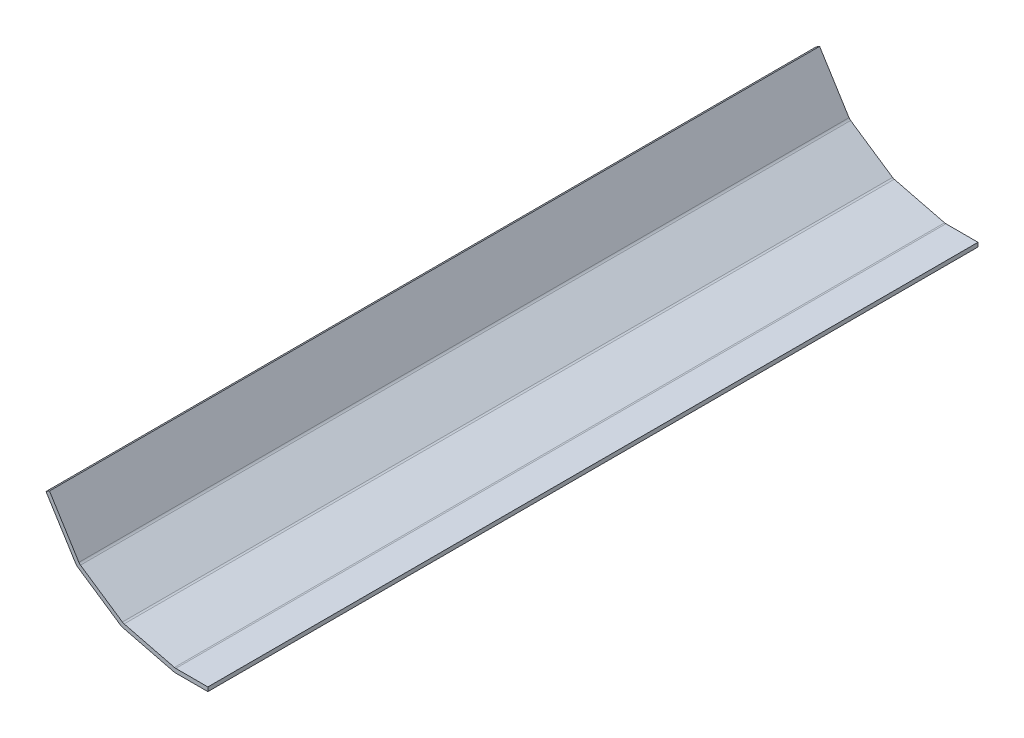
ISO-10303-21;
HEADER;
FILE_DESCRIPTION(('STEP AP214'),'2;1');
FILE_NAME('part.step','',(''),(''),'','','');
FILE_SCHEMA(('AUTOMOTIVE_DESIGN { 1 0 10303 214 1 1 1 1 }'));
ENDSEC;
DATA;
#1=APPLICATION_CONTEXT('core data for automotive mechanical design processes');
#2=APPLICATION_PROTOCOL_DEFINITION('international standard','automotive_design',2000,#1);
#3=PRODUCT_CONTEXT('',#1,'mechanical');
#4=PRODUCT('Part','Part','',(#3));
#5=PRODUCT_RELATED_PRODUCT_CATEGORY('part','',(#4));
#6=PRODUCT_DEFINITION_FORMATION('','',#4);
#7=PRODUCT_DEFINITION_CONTEXT('part definition',#1,'design');
#8=PRODUCT_DEFINITION('design','',#6,#7);
#9=PRODUCT_DEFINITION_SHAPE('','',#8);
#10=(LENGTH_UNIT() NAMED_UNIT(*) SI_UNIT(.MILLI.,.METRE.));
#11=(NAMED_UNIT(*) PLANE_ANGLE_UNIT() SI_UNIT($,.RADIAN.));
#12=(NAMED_UNIT(*) SI_UNIT($,.STERADIAN.) SOLID_ANGLE_UNIT());
#13=UNCERTAINTY_MEASURE_WITH_UNIT(LENGTH_MEASURE(1.E-05),#10,'distance_accuracy_value','');
#14=(GEOMETRIC_REPRESENTATION_CONTEXT(3) GLOBAL_UNCERTAINTY_ASSIGNED_CONTEXT((#13)) GLOBAL_UNIT_ASSIGNED_CONTEXT((#10,
#11,#12)) REPRESENTATION_CONTEXT('',''));
#15=CARTESIAN_POINT('',(0.,0.,0.));
#16=DIRECTION('',(0.,0.,1.));
#17=DIRECTION('',(1.,0.,0.));
#18=AXIS2_PLACEMENT_3D('',#15,#16,#17);
#19=CARTESIAN_POINT('',(151.999999999886,1.50000000001131,282.));
#20=DIRECTION('',(-1.,0.,0.));
#21=DIRECTION('',(0.,0.,1.));
#22=AXIS2_PLACEMENT_3D('',#19,#20,#21);
#23=PLANE('',#22);
#24=DIRECTION('',(0.,1.,0.));
#25=VECTOR('',#24,1.);
#26=CARTESIAN_POINT('',(151.999999999886,1.50000000001131,0.));
#27=LINE('',#26,#25);
#28=CARTESIAN_POINT('',(151.999999999886,1.50000000001131,0.));
#29=VERTEX_POINT('',#28);
#30=CARTESIAN_POINT('',(151.999999999886,2.99999999983093,0.));
#31=VERTEX_POINT('',#30);
#32=EDGE_CURVE('E195',#29,#31,#27,.T.);
#33=ORIENTED_EDGE('',*,*,#32,.T.);
#34=DIRECTION('',(0.,0.,-1.));
#35=VECTOR('',#34,1.);
#36=CARTESIAN_POINT('',(151.999999999886,2.99999999983093,282.));
#37=LINE('',#36,#35);
#38=CARTESIAN_POINT('',(151.999999999886,2.99999999983093,282.));
#39=VERTEX_POINT('',#38);
#40=EDGE_CURVE('E11',#39,#31,#37,.T.);
#41=ORIENTED_EDGE('',*,*,#40,.F.);
#42=DIRECTION('',(0.,1.,0.));
#43=VECTOR('',#42,1.);
#44=CARTESIAN_POINT('',(151.999999999886,1.50000000001131,282.));
#45=LINE('',#44,#43);
#46=CARTESIAN_POINT('',(151.999999999886,1.50000000001131,282.));
#47=VERTEX_POINT('',#46);
#48=EDGE_CURVE('E241',#47,#39,#45,.T.);
#49=ORIENTED_EDGE('',*,*,#48,.F.);
#50=DIRECTION('',(0.,0.,-1.));
#51=VECTOR('',#50,1.);
#52=CARTESIAN_POINT('',(151.999999999886,1.50000000001131,282.));
#53=LINE('',#52,#51);
#54=EDGE_CURVE('E191',#47,#29,#53,.T.);
#55=ORIENTED_EDGE('',*,*,#54,.T.);
#56=EDGE_LOOP('',(#33,#41,#49,#55));
#57=FACE_BOUND('',#56,.T.);
#58=ADVANCED_FACE('F45',(#57),#23,.F.);
#59=CARTESIAN_POINT('',(151.999999999886,2.99999999983093,282.));
#60=DIRECTION('',(0.,-1.,0.));
#61=DIRECTION('',(0.,0.,-1.));
#62=AXIS2_PLACEMENT_3D('',#59,#60,#61);
#63=PLANE('',#62);
#64=DIRECTION('',(-1.,0.,0.));
#65=VECTOR('',#64,1.);
#66=CARTESIAN_POINT('',(151.999999999886,2.99999999983093,0.));
#67=LINE('',#66,#65);
#68=CARTESIAN_POINT('',(140.245569121886,2.99999999983093,0.));
#69=VERTEX_POINT('',#68);
#70=EDGE_CURVE('E199',#31,#69,#67,.T.);
#71=ORIENTED_EDGE('',*,*,#70,.T.);
#72=DIRECTION('',(0.,0.,-1.));
#73=VECTOR('',#72,1.);
#74=CARTESIAN_POINT('',(140.245569121886,2.99999999983093,282.));
#75=LINE('',#74,#73);
#76=CARTESIAN_POINT('',(140.245569121886,2.99999999983093,282.));
#77=VERTEX_POINT('',#76);
#78=EDGE_CURVE('E54',#77,#69,#75,.T.);
#79=ORIENTED_EDGE('',*,*,#78,.F.);
#80=DIRECTION('',(-1.,0.,0.));
#81=VECTOR('',#80,1.);
#82=CARTESIAN_POINT('',(151.999999999886,2.99999999983093,282.));
#83=LINE('',#82,#81);
#84=EDGE_CURVE('E129',#39,#77,#83,.T.);
#85=ORIENTED_EDGE('',*,*,#84,.F.);
#86=ORIENTED_EDGE('',*,*,#40,.T.);
#87=EDGE_LOOP('',(#71,#79,#85,#86));
#88=FACE_BOUND('',#87,.T.);
#89=ADVANCED_FACE('F361',(#88),#63,.F.);
#90=CARTESIAN_POINT('',(140.24556912768,5.0000000600324,282.));
#91=DIRECTION('',(0.,0.,-1.));
#92=DIRECTION('',(-1.,0.,0.));
#93=AXIS2_PLACEMENT_3D('',#90,#91,#92);
#94=CYLINDRICAL_SURFACE('',#93,2.00000006020147);
#95=CARTESIAN_POINT('',(140.24556912768,5.0000000600324,0.));
#96=DIRECTION('',(0.,0.,-1.));
#97=DIRECTION('',(-1.,0.,0.));
#98=AXIS2_PLACEMENT_3D('',#95,#96,#97);
#99=CIRCLE('',#98,2.00000006020147);
#100=CARTESIAN_POINT('',(139.761725330886,3.05940854683092,0.));
#101=VERTEX_POINT('',#100);
#102=EDGE_CURVE('E202',#69,#101,#99,.T.);
#103=ORIENTED_EDGE('',*,*,#102,.T.);
#104=DIRECTION('',(0.,0.,-1.));
#105=VECTOR('',#104,1.);
#106=CARTESIAN_POINT('',(139.761725330886,3.05940854683092,282.));
#107=LINE('',#106,#105);
#108=CARTESIAN_POINT('',(139.761725330886,3.05940854683092,282.));
#109=VERTEX_POINT('',#108);
#110=EDGE_CURVE('E284',#109,#101,#107,.T.);
#111=ORIENTED_EDGE('',*,*,#110,.F.);
#112=CARTESIAN_POINT('',(140.24556912768,5.0000000600324,282.));
#113=DIRECTION('',(0.,0.,-1.));
#114=DIRECTION('',(-1.,0.,0.));
#115=AXIS2_PLACEMENT_3D('',#112,#113,#114);
#116=CIRCLE('',#115,2.00000006020147);
#117=EDGE_CURVE('E295',#77,#109,#116,.T.);
#118=ORIENTED_EDGE('',*,*,#117,.F.);
#119=ORIENTED_EDGE('',*,*,#78,.T.);
#120=EDGE_LOOP('',(#103,#111,#118,#119));
#121=FACE_BOUND('',#120,.T.);
#122=ADVANCED_FACE('F293',(#121),#94,.F.);
#123=CARTESIAN_POINT('',(139.761725330886,3.05940854683092,282.));
#124=DIRECTION('',(-0.241921895612643,-0.970295726272761,0.));
#125=DIRECTION('',(0.970295726272762,-0.241921895612643,0.));
#126=AXIS2_PLACEMENT_3D('',#123,#124,#125);
#127=PLANE('',#126);
#128=DIRECTION('',(-0.970295726272761,0.241921895612643,0.));
#129=VECTOR('',#128,1.);
#130=CARTESIAN_POINT('',(139.761725330886,3.05940854683092,0.));
#131=LINE('',#130,#129);
#132=CARTESIAN_POINT('',(121.342178631886,7.65191733883092,0.));
#133=VERTEX_POINT('',#132);
#134=EDGE_CURVE('E205',#101,#133,#131,.T.);
#135=ORIENTED_EDGE('',*,*,#134,.T.);
#136=DIRECTION('',(0.,0.,-1.));
#137=VECTOR('',#136,1.);
#138=CARTESIAN_POINT('',(121.342178631886,7.65191733883092,282.));
#139=LINE('',#138,#137);
#140=CARTESIAN_POINT('',(121.342178631886,7.65191733883092,282.));
#141=VERTEX_POINT('',#140);
#142=EDGE_CURVE('E280',#141,#133,#139,.T.);
#143=ORIENTED_EDGE('',*,*,#142,.F.);
#144=DIRECTION('',(-0.970295726272761,0.241921895612643,0.));
#145=VECTOR('',#144,1.);
#146=CARTESIAN_POINT('',(139.761725330886,3.05940854683092,282.));
#147=LINE('',#146,#145);
#148=EDGE_CURVE('E313',#109,#141,#147,.T.);
#149=ORIENTED_EDGE('',*,*,#148,.F.);
#150=ORIENTED_EDGE('',*,*,#110,.T.);
#151=EDGE_LOOP('',(#135,#143,#149,#150));
#152=FACE_BOUND('',#151,.T.);
#153=ADVANCED_FACE('F304',(#152),#127,.F.);
#154=CARTESIAN_POINT('',(121.826022412614,9.59250876561039,282.));
#155=DIRECTION('',(0.,0.,-1.));
#156=DIRECTION('',(-1.,0.,0.));
#157=AXIS2_PLACEMENT_3D('',#154,#155,#156);
#158=CYLINDRICAL_SURFACE('',#157,1.99999997245991);
#159=CARTESIAN_POINT('',(121.826022412614,9.59250876561039,0.));
#160=DIRECTION('',(0.,0.,-1.));
#161=DIRECTION('',(-1.,0.,0.));
#162=AXIS2_PLACEMENT_3D('',#159,#160,#161);
#163=CIRCLE('',#162,1.99999997245991);
#164=CARTESIAN_POINT('',(120.707636615886,7.93443364683092,0.));
#165=VERTEX_POINT('',#164);
#166=EDGE_CURVE('E208',#133,#165,#163,.T.);
#167=ORIENTED_EDGE('',*,*,#166,.T.);
#168=DIRECTION('',(0.,0.,-1.));
#169=VECTOR('',#168,1.);
#170=CARTESIAN_POINT('',(120.707636615886,7.93443364683092,282.));
#171=LINE('',#170,#169);
#172=CARTESIAN_POINT('',(120.707636615886,7.93443364683092,282.));
#173=VERTEX_POINT('',#172);
#174=EDGE_CURVE('E276',#173,#165,#171,.T.);
#175=ORIENTED_EDGE('',*,*,#174,.F.);
#176=CARTESIAN_POINT('',(121.826022412614,9.59250876561039,282.));
#177=DIRECTION('',(0.,0.,-1.));
#178=DIRECTION('',(-1.,0.,0.));
#179=AXIS2_PLACEMENT_3D('',#176,#177,#178);
#180=CIRCLE('',#179,1.99999997245991);
#181=EDGE_CURVE('E310',#141,#173,#180,.T.);
#182=ORIENTED_EDGE('',*,*,#181,.F.);
#183=ORIENTED_EDGE('',*,*,#142,.T.);
#184=EDGE_LOOP('',(#167,#175,#182,#183));
#185=FACE_BOUND('',#184,.T.);
#186=ADVANCED_FACE('F308',(#185),#158,.F.);
#187=CARTESIAN_POINT('',(120.707636615886,7.93443364683092,282.));
#188=DIRECTION('',(-0.559192903466935,-0.829037572557613,0.));
#189=DIRECTION('',(0.829037572557613,-0.559192903466935,0.));
#190=AXIS2_PLACEMENT_3D('',#187,#188,#189);
#191=PLANE('',#190);
#192=DIRECTION('',(-0.829037572557613,0.559192903466935,0.));
#193=VECTOR('',#192,1.);
#194=CARTESIAN_POINT('',(120.707636615886,7.93443364683092,0.));
#195=LINE('',#194,#193);
#196=CARTESIAN_POINT('',(105.352434751886,18.2916480818309,0.));
#197=VERTEX_POINT('',#196);
#198=EDGE_CURVE('E211',#165,#197,#195,.T.);
#199=ORIENTED_EDGE('',*,*,#198,.T.);
#200=DIRECTION('',(0.,0.,-1.));
#201=VECTOR('',#200,1.);
#202=CARTESIAN_POINT('',(105.352434751886,18.2916480818309,282.));
#203=LINE('',#202,#201);
#204=CARTESIAN_POINT('',(105.352434751886,18.2916480818309,282.));
#205=VERTEX_POINT('',#204);
#206=EDGE_CURVE('E272',#205,#197,#203,.T.);
#207=ORIENTED_EDGE('',*,*,#206,.F.);
#208=DIRECTION('',(-0.829037572557613,0.559192903466935,0.));
#209=VECTOR('',#208,1.);
#210=CARTESIAN_POINT('',(120.707636615886,7.93443364683092,282.));
#211=LINE('',#210,#209);
#212=EDGE_CURVE('E312',#173,#205,#211,.T.);
#213=ORIENTED_EDGE('',*,*,#212,.F.);
#214=ORIENTED_EDGE('',*,*,#174,.T.);
#215=EDGE_LOOP('',(#199,#207,#213,#214));
#216=FACE_BOUND('',#215,.T.);
#217=ADVANCED_FACE('F372',(#216),#191,.F.);
#218=CARTESIAN_POINT('',(106.470820561107,19.9497232320652,282.));
#219=DIRECTION('',(0.,0.,-1.));
#220=DIRECTION('',(-1.,0.,0.));
#221=AXIS2_PLACEMENT_3D('',#218,#219,#220);
#222=CYLINDRICAL_SURFACE('',#221,2.00000000552306);
#223=CARTESIAN_POINT('',(106.470820561107,19.9497232320652,0.));
#224=DIRECTION('',(0.,0.,-1.));
#225=DIRECTION('',(-1.,0.,0.));
#226=AXIS2_PLACEMENT_3D('',#223,#224,#225);
#227=CIRCLE('',#226,2.00000000552306);
#228=CARTESIAN_POINT('',(104.774724365886,18.8898846978309,0.));
#229=VERTEX_POINT('',#228);
#230=EDGE_CURVE('E214',#197,#229,#227,.T.);
#231=ORIENTED_EDGE('',*,*,#230,.T.);
#232=DIRECTION('',(0.,0.,-1.));
#233=VECTOR('',#232,1.);
#234=CARTESIAN_POINT('',(104.774724365886,18.8898846978309,282.));
#235=LINE('',#234,#233);
#236=CARTESIAN_POINT('',(104.774724365886,18.8898846978309,282.));
#237=VERTEX_POINT('',#236);
#238=EDGE_CURVE('E268',#237,#229,#235,.T.);
#239=ORIENTED_EDGE('',*,*,#238,.F.);
#240=CARTESIAN_POINT('',(106.470820561107,19.9497232320652,282.));
#241=DIRECTION('',(0.,0.,-1.));
#242=DIRECTION('',(-1.,0.,0.));
#243=AXIS2_PLACEMENT_3D('',#240,#241,#242);
#244=CIRCLE('',#243,2.00000000552306);
#245=EDGE_CURVE('E316',#205,#237,#244,.T.);
#246=ORIENTED_EDGE('',*,*,#245,.F.);
#247=ORIENTED_EDGE('',*,*,#206,.T.);
#248=EDGE_LOOP('',(#231,#239,#246,#247));
#249=FACE_BOUND('',#248,.T.);
#250=ADVANCED_FACE('F375',(#249),#222,.F.);
#251=CARTESIAN_POINT('',(104.774724365886,18.8898846978309,282.));
#252=DIRECTION('',(-0.848048096172864,-0.529919264206898,0.));
#253=DIRECTION('',(0.529919264206898,-0.848048096172864,0.));
#254=AXIS2_PLACEMENT_3D('',#251,#252,#253);
#255=PLANE('',#254);
#256=DIRECTION('',(-0.529919264206898,0.848048096172864,0.));
#257=VECTOR('',#256,1.);
#258=CARTESIAN_POINT('',(104.774724365886,18.8898846978309,0.));
#259=LINE('',#258,#257);
#260=CARTESIAN_POINT('',(93.999999999886,36.1330481428309,0.));
#261=VERTEX_POINT('',#260);
#262=EDGE_CURVE('E217',#229,#261,#259,.T.);
#263=ORIENTED_EDGE('',*,*,#262,.T.);
#264=DIRECTION('',(0.,0.,-1.));
#265=VECTOR('',#264,1.);
#266=CARTESIAN_POINT('',(93.999999999886,36.1330481428309,282.));
#267=LINE('',#266,#265);
#268=CARTESIAN_POINT('',(93.999999999886,36.1330481428309,282.));
#269=VERTEX_POINT('',#268);
#270=EDGE_CURVE('E264',#269,#261,#267,.T.);
#271=ORIENTED_EDGE('',*,*,#270,.F.);
#272=DIRECTION('',(-0.529919264206898,0.848048096172864,0.));
#273=VECTOR('',#272,1.);
#274=CARTESIAN_POINT('',(104.774724365886,18.8898846978309,282.));
#275=LINE('',#274,#273);
#276=EDGE_CURVE('E324',#237,#269,#275,.T.);
#277=ORIENTED_EDGE('',*,*,#276,.F.);
#278=ORIENTED_EDGE('',*,*,#238,.T.);
#279=EDGE_LOOP('',(#263,#271,#277,#278));
#280=FACE_BOUND('',#279,.T.);
#281=ADVANCED_FACE('F379',(#280),#255,.F.);
#282=CARTESIAN_POINT('',(93.999999999886,36.1330481428309,282.));
#283=DIRECTION('',(0.52991926413578,-0.848048096217304,0.));
#284=DIRECTION('',(0.848048096217304,0.52991926413578,0.));
#285=AXIS2_PLACEMENT_3D('',#282,#283,#284);
#286=PLANE('',#285);
#287=DIRECTION('',(-0.848048096217304,-0.52991926413578,0.));
#288=VECTOR('',#287,1.);
#289=CARTESIAN_POINT('',(93.999999999886,36.1330481428309,0.));
#290=LINE('',#289,#288);
#291=CARTESIAN_POINT('',(92.727927855713,35.3381692467229,0.));
#292=VERTEX_POINT('',#291);
#293=EDGE_CURVE('E220',#261,#292,#290,.T.);
#294=ORIENTED_EDGE('',*,*,#293,.T.);
#295=DIRECTION('',(0.,0.,-1.));
#296=VECTOR('',#295,1.);
#297=CARTESIAN_POINT('',(92.727927855713,35.3381692467229,282.));
#298=LINE('',#297,#296);
#299=CARTESIAN_POINT('',(92.727927855713,35.3381692467229,282.));
#300=VERTEX_POINT('',#299);
#301=EDGE_CURVE('E260',#300,#292,#298,.T.);
#302=ORIENTED_EDGE('',*,*,#301,.F.);
#303=DIRECTION('',(-0.848048096217304,-0.52991926413578,0.));
#304=VECTOR('',#303,1.);
#305=CARTESIAN_POINT('',(93.999999999886,36.1330481428309,282.));
#306=LINE('',#305,#304);
#307=EDGE_CURVE('E327',#269,#300,#306,.T.);
#308=ORIENTED_EDGE('',*,*,#307,.F.);
#309=ORIENTED_EDGE('',*,*,#270,.T.);
#310=EDGE_LOOP('',(#294,#302,#308,#309));
#311=FACE_BOUND('',#310,.T.);
#312=ADVANCED_FACE('F383',(#311),#286,.F.);
#313=CARTESIAN_POINT('',(92.727927855713,35.3381692467229,282.));
#314=DIRECTION('',(0.848048096172865,0.529919264206897,0.));
#315=DIRECTION('',(-0.529919264206897,0.848048096172865,0.));
#316=AXIS2_PLACEMENT_3D('',#313,#314,#315);
#317=PLANE('',#316);
#318=DIRECTION('',(0.529919264206897,-0.848048096172865,0.));
#319=VECTOR('',#318,1.);
#320=CARTESIAN_POINT('',(92.727927855713,35.3381692467229,0.));
#321=LINE('',#320,#319);
#322=CARTESIAN_POINT('',(103.502652221713,18.0950058017228,0.));
#323=VERTEX_POINT('',#322);
#324=EDGE_CURVE('E223',#292,#323,#321,.T.);
#325=ORIENTED_EDGE('',*,*,#324,.T.);
#326=DIRECTION('',(0.,0.,-1.));
#327=VECTOR('',#326,1.);
#328=CARTESIAN_POINT('',(103.502652221713,18.0950058017228,282.));
#329=LINE('',#328,#327);
#330=CARTESIAN_POINT('',(103.502652221713,18.0950058017228,282.));
#331=VERTEX_POINT('',#330);
#332=EDGE_CURVE('E256',#331,#323,#329,.T.);
#333=ORIENTED_EDGE('',*,*,#332,.F.);
#334=DIRECTION('',(0.529919264206897,-0.848048096172865,0.));
#335=VECTOR('',#334,1.);
#336=CARTESIAN_POINT('',(92.727927855713,35.3381692467229,282.));
#337=LINE('',#336,#335);
#338=EDGE_CURVE('E329',#300,#331,#337,.T.);
#339=ORIENTED_EDGE('',*,*,#338,.F.);
#340=ORIENTED_EDGE('',*,*,#301,.T.);
#341=EDGE_LOOP('',(#325,#333,#339,#340));
#342=FACE_BOUND('',#341,.T.);
#343=ADVANCED_FACE('F387',(#342),#317,.F.);
#344=CARTESIAN_POINT('',(106.470820561107,19.9497232320652,282.));
#345=DIRECTION('',(0.,0.,-1.));
#346=DIRECTION('',(-1.,0.,0.));
#347=AXIS2_PLACEMENT_3D('',#344,#345,#346);
#348=CYLINDRICAL_SURFACE('',#347,3.50000000534266);
#349=CARTESIAN_POINT('',(106.470820561107,19.9497232320652,0.));
#350=DIRECTION('',(0.,0.,1.));
#351=DIRECTION('',(1.,0.,0.));
#352=AXIS2_PLACEMENT_3D('',#349,#350,#351);
#353=CIRCLE('',#352,3.50000000534266);
#354=CARTESIAN_POINT('',(104.513645397,17.048091723,0.));
#355=VERTEX_POINT('',#354);
#356=EDGE_CURVE('E226',#323,#355,#353,.T.);
#357=ORIENTED_EDGE('',*,*,#356,.T.);
#358=DIRECTION('',(0.,0.,-1.));
#359=VECTOR('',#358,1.);
#360=CARTESIAN_POINT('',(104.513645397,17.048091723,282.));
#361=LINE('',#360,#359);
#362=CARTESIAN_POINT('',(104.513645397,17.048091723,282.));
#363=VERTEX_POINT('',#362);
#364=EDGE_CURVE('E252',#363,#355,#361,.T.);
#365=ORIENTED_EDGE('',*,*,#364,.F.);
#366=CARTESIAN_POINT('',(106.470820561107,19.9497232320652,282.));
#367=DIRECTION('',(0.,0.,1.));
#368=DIRECTION('',(1.,0.,0.));
#369=AXIS2_PLACEMENT_3D('',#366,#367,#368);
#370=CIRCLE('',#369,3.50000000534266);
#371=EDGE_CURVE('E332',#331,#363,#370,.T.);
#372=ORIENTED_EDGE('',*,*,#371,.F.);
#373=ORIENTED_EDGE('',*,*,#332,.T.);
#374=EDGE_LOOP('',(#357,#365,#372,#373));
#375=FACE_BOUND('',#374,.T.);
#376=ADVANCED_FACE('F391',(#375),#348,.T.);
#377=CARTESIAN_POINT('',(104.513645397,17.048091723,282.));
#378=DIRECTION('',(0.559192903466936,0.829037572557612,0.));
#379=DIRECTION('',(-0.829037572557612,0.559192903466936,0.));
#380=AXIS2_PLACEMENT_3D('',#377,#378,#379);
#381=PLANE('',#380);
#382=DIRECTION('',(0.829037572557612,-0.559192903466936,0.));
#383=VECTOR('',#382,1.);
#384=CARTESIAN_POINT('',(104.513645397,17.048091723,0.));
#385=LINE('',#384,#383);
#386=CARTESIAN_POINT('',(119.868847261,6.690877288,0.));
#387=VERTEX_POINT('',#386);
#388=EDGE_CURVE('E229',#355,#387,#385,.T.);
#389=ORIENTED_EDGE('',*,*,#388,.T.);
#390=DIRECTION('',(0.,0.,-1.));
#391=VECTOR('',#390,1.);
#392=CARTESIAN_POINT('',(119.868847261,6.690877288,282.));
#393=LINE('',#392,#391);
#394=CARTESIAN_POINT('',(119.868847261,6.690877288,282.));
#395=VERTEX_POINT('',#394);
#396=EDGE_CURVE('E248',#395,#387,#393,.T.);
#397=ORIENTED_EDGE('',*,*,#396,.F.);
#398=DIRECTION('',(0.829037572557612,-0.559192903466936,0.));
#399=VECTOR('',#398,1.);
#400=CARTESIAN_POINT('',(104.513645397,17.048091723,282.));
#401=LINE('',#400,#399);
#402=EDGE_CURVE('E335',#363,#395,#401,.T.);
#403=ORIENTED_EDGE('',*,*,#402,.F.);
#404=ORIENTED_EDGE('',*,*,#364,.T.);
#405=EDGE_LOOP('',(#389,#397,#403,#404));
#406=FACE_BOUND('',#405,.T.);
#407=ADVANCED_FACE('F343',(#406),#381,.F.);
#408=CARTESIAN_POINT('',(121.826022412614,9.59250876561039,282.));
#409=DIRECTION('',(0.,0.,-1.));
#410=DIRECTION('',(-1.,0.,0.));
#411=AXIS2_PLACEMENT_3D('',#408,#409,#410);
#412=CYLINDRICAL_SURFACE('',#411,3.49999997227952);
#413=CARTESIAN_POINT('',(121.826022412614,9.59250876561039,0.));
#414=DIRECTION('',(0.,0.,1.));
#415=DIRECTION('',(1.,0.,0.));
#416=AXIS2_PLACEMENT_3D('',#413,#414,#415);
#417=CIRCLE('',#416,3.49999997227952);
#418=CARTESIAN_POINT('',(120.979295787868,6.19647374975715,0.));
#419=VERTEX_POINT('',#418);
#420=EDGE_CURVE('E232',#387,#419,#417,.T.);
#421=ORIENTED_EDGE('',*,*,#420,.T.);
#422=DIRECTION('',(0.,0.,-1.));
#423=VECTOR('',#422,1.);
#424=CARTESIAN_POINT('',(120.979295787868,6.19647374975715,282.));
#425=LINE('',#424,#423);
#426=CARTESIAN_POINT('',(120.979295787868,6.19647374975715,282.));
#427=VERTEX_POINT('',#426);
#428=EDGE_CURVE('E183',#427,#419,#425,.T.);
#429=ORIENTED_EDGE('',*,*,#428,.F.);
#430=CARTESIAN_POINT('',(121.826022412614,9.59250876561039,282.));
#431=DIRECTION('',(0.,0.,1.));
#432=DIRECTION('',(1.,0.,0.));
#433=AXIS2_PLACEMENT_3D('',#430,#431,#432);
#434=CIRCLE('',#433,3.49999997227952);
#435=EDGE_CURVE('E172',#395,#427,#434,.T.);
#436=ORIENTED_EDGE('',*,*,#435,.F.);
#437=ORIENTED_EDGE('',*,*,#396,.T.);
#438=EDGE_LOOP('',(#421,#429,#436,#437));
#439=FACE_BOUND('',#438,.T.);
#440=ADVANCED_FACE('F347',(#439),#412,.T.);
#441=CARTESIAN_POINT('',(120.979295787868,6.19647374975715,282.));
#442=DIRECTION('',(0.241921895612643,0.970295726272761,0.));
#443=DIRECTION('',(-0.970295726272762,0.241921895612643,0.));
#444=AXIS2_PLACEMENT_3D('',#441,#442,#443);
#445=PLANE('',#444);
#446=DIRECTION('',(0.970295726272761,-0.241921895612643,0.));
#447=VECTOR('',#446,1.);
#448=CARTESIAN_POINT('',(120.979295787868,6.19647374975715,0.));
#449=LINE('',#448,#447);
#450=CARTESIAN_POINT('',(139.398842486868,1.60396495775715,0.));
#451=VERTEX_POINT('',#450);
#452=EDGE_CURVE('E181',#419,#451,#449,.T.);
#453=ORIENTED_EDGE('',*,*,#452,.T.);
#454=DIRECTION('',(0.,0.,-1.));
#455=VECTOR('',#454,1.);
#456=CARTESIAN_POINT('',(139.398842486868,1.60396495775715,282.));
#457=LINE('',#456,#455);
#458=CARTESIAN_POINT('',(139.398842486868,1.60396495775715,282.));
#459=VERTEX_POINT('',#458);
#460=EDGE_CURVE('E178',#459,#451,#457,.T.);
#461=ORIENTED_EDGE('',*,*,#460,.F.);
#462=DIRECTION('',(0.970295726272761,-0.241921895612643,0.));
#463=VECTOR('',#462,1.);
#464=CARTESIAN_POINT('',(120.979295787868,6.19647374975715,282.));
#465=LINE('',#464,#463);
#466=EDGE_CURVE('E166',#427,#459,#465,.T.);
#467=ORIENTED_EDGE('',*,*,#466,.F.);
#468=ORIENTED_EDGE('',*,*,#428,.T.);
#469=EDGE_LOOP('',(#453,#461,#467,#468));
#470=FACE_BOUND('',#469,.T.);
#471=ADVANCED_FACE('F179',(#470),#445,.F.);
#472=CARTESIAN_POINT('',(140.24556912768,5.0000000600324,282.));
#473=DIRECTION('',(0.,0.,-1.));
#474=DIRECTION('',(-1.,0.,0.));
#475=AXIS2_PLACEMENT_3D('',#472,#473,#474);
#476=CYLINDRICAL_SURFACE('',#475,3.50000006002109);
#477=CARTESIAN_POINT('',(140.24556912768,5.0000000600324,0.));
#478=DIRECTION('',(0.,0.,1.));
#479=DIRECTION('',(1.,0.,0.));
#480=AXIS2_PLACEMENT_3D('',#477,#478,#479);
#481=CIRCLE('',#480,3.50000006002109);
#482=CARTESIAN_POINT('',(140.245569121886,1.50000000001131,0.));
#483=VERTEX_POINT('',#482);
#484=EDGE_CURVE('E115',#451,#483,#481,.T.);
#485=ORIENTED_EDGE('',*,*,#484,.T.);
#486=DIRECTION('',(0.,0.,-1.));
#487=VECTOR('',#486,1.);
#488=CARTESIAN_POINT('',(140.245569121886,1.50000000001131,282.));
#489=LINE('',#488,#487);
#490=CARTESIAN_POINT('',(140.245569121886,1.50000000001131,282.));
#491=VERTEX_POINT('',#490);
#492=EDGE_CURVE('E184',#491,#483,#489,.T.);
#493=ORIENTED_EDGE('',*,*,#492,.F.);
#494=CARTESIAN_POINT('',(140.24556912768,5.0000000600324,282.));
#495=DIRECTION('',(0.,0.,1.));
#496=DIRECTION('',(1.,0.,0.));
#497=AXIS2_PLACEMENT_3D('',#494,#495,#496);
#498=CIRCLE('',#497,3.50000006002109);
#499=EDGE_CURVE('E170',#459,#491,#498,.T.);
#500=ORIENTED_EDGE('',*,*,#499,.F.);
#501=ORIENTED_EDGE('',*,*,#460,.T.);
#502=EDGE_LOOP('',(#485,#493,#500,#501));
#503=FACE_BOUND('',#502,.T.);
#504=ADVANCED_FACE('F186',(#503),#476,.T.);
#505=CARTESIAN_POINT('',(140.245569121886,1.50000000001131,282.));
#506=DIRECTION('',(0.,1.,0.));
#507=DIRECTION('',(0.,0.,1.));
#508=AXIS2_PLACEMENT_3D('',#505,#506,#507);
#509=PLANE('',#508);
#510=DIRECTION('',(1.,0.,0.));
#511=VECTOR('',#510,1.);
#512=CARTESIAN_POINT('',(140.245569121886,1.50000000001131,0.));
#513=LINE('',#512,#511);
#514=EDGE_CURVE('E121',#483,#29,#513,.T.);
#515=ORIENTED_EDGE('',*,*,#514,.T.);
#516=ORIENTED_EDGE('',*,*,#54,.F.);
#517=DIRECTION('',(1.,0.,0.));
#518=VECTOR('',#517,1.);
#519=CARTESIAN_POINT('',(140.245569121886,1.50000000001131,282.));
#520=LINE('',#519,#518);
#521=EDGE_CURVE('E62',#491,#47,#520,.T.);
#522=ORIENTED_EDGE('',*,*,#521,.F.);
#523=ORIENTED_EDGE('',*,*,#492,.T.);
#524=EDGE_LOOP('',(#515,#516,#522,#523));
#525=FACE_BOUND('',#524,.T.);
#526=ADVANCED_FACE('F351',(#525),#509,.F.);
#527=CARTESIAN_POINT('',(140.24556912768,5.0000000600324,282.));
#528=DIRECTION('',(0.,0.,-1.));
#529=DIRECTION('',(-1.,0.,0.));
#530=AXIS2_PLACEMENT_3D('',#527,#528,#529);
#531=PLANE('',#530);
#532=ORIENTED_EDGE('',*,*,#48,.T.);
#533=ORIENTED_EDGE('',*,*,#84,.T.);
#534=ORIENTED_EDGE('',*,*,#117,.T.);
#535=ORIENTED_EDGE('',*,*,#148,.T.);
#536=ORIENTED_EDGE('',*,*,#181,.T.);
#537=ORIENTED_EDGE('',*,*,#212,.T.);
#538=ORIENTED_EDGE('',*,*,#245,.T.);
#539=ORIENTED_EDGE('',*,*,#276,.T.);
#540=ORIENTED_EDGE('',*,*,#307,.T.);
#541=ORIENTED_EDGE('',*,*,#338,.T.);
#542=ORIENTED_EDGE('',*,*,#371,.T.);
#543=ORIENTED_EDGE('',*,*,#402,.T.);
#544=ORIENTED_EDGE('',*,*,#435,.T.);
#545=ORIENTED_EDGE('',*,*,#466,.T.);
#546=ORIENTED_EDGE('',*,*,#499,.T.);
#547=ORIENTED_EDGE('',*,*,#521,.T.);
#548=EDGE_LOOP('',(#532,#533,#534,#535,#536,#537,#538,#539,#540,#541,#542,#543,#544,#545,#546,#547));
#549=FACE_BOUND('',#548,.T.);
#550=ADVANCED_FACE('F168',(#549),#531,.F.);
#551=CARTESIAN_POINT('',(140.24556912768,5.0000000600324,0.));
#552=DIRECTION('',(0.,0.,-1.));
#553=DIRECTION('',(-1.,0.,0.));
#554=AXIS2_PLACEMENT_3D('',#551,#552,#553);
#555=PLANE('',#554);
#556=ORIENTED_EDGE('',*,*,#32,.F.);
#557=ORIENTED_EDGE('',*,*,#514,.F.);
#558=ORIENTED_EDGE('',*,*,#484,.F.);
#559=ORIENTED_EDGE('',*,*,#452,.F.);
#560=ORIENTED_EDGE('',*,*,#420,.F.);
#561=ORIENTED_EDGE('',*,*,#388,.F.);
#562=ORIENTED_EDGE('',*,*,#356,.F.);
#563=ORIENTED_EDGE('',*,*,#324,.F.);
#564=ORIENTED_EDGE('',*,*,#293,.F.);
#565=ORIENTED_EDGE('',*,*,#262,.F.);
#566=ORIENTED_EDGE('',*,*,#230,.F.);
#567=ORIENTED_EDGE('',*,*,#198,.F.);
#568=ORIENTED_EDGE('',*,*,#166,.F.);
#569=ORIENTED_EDGE('',*,*,#134,.F.);
#570=ORIENTED_EDGE('',*,*,#102,.F.);
#571=ORIENTED_EDGE('',*,*,#70,.F.);
#572=EDGE_LOOP('',(#556,#557,#558,#559,#560,#561,#562,#563,#564,#565,#566,#567,#568,#569,#570,#571));
#573=FACE_BOUND('',#572,.T.);
#574=ADVANCED_FACE('F299',(#573),#555,.T.);
#575=CLOSED_SHELL('',(#58,#89,#122,#153,#186,#217,#250,#281,#312,#343,#376,#407,#440,#471,#504,
#526,#550,#574));
#576=MANIFOLD_SOLID_BREP('B2',#575);
#577=ADVANCED_BREP_SHAPE_REPRESENTATION('',(#18,#576),#14);
#578=SHAPE_DEFINITION_REPRESENTATION(#9,#577);
ENDSEC;
END-ISO-10303-21;
